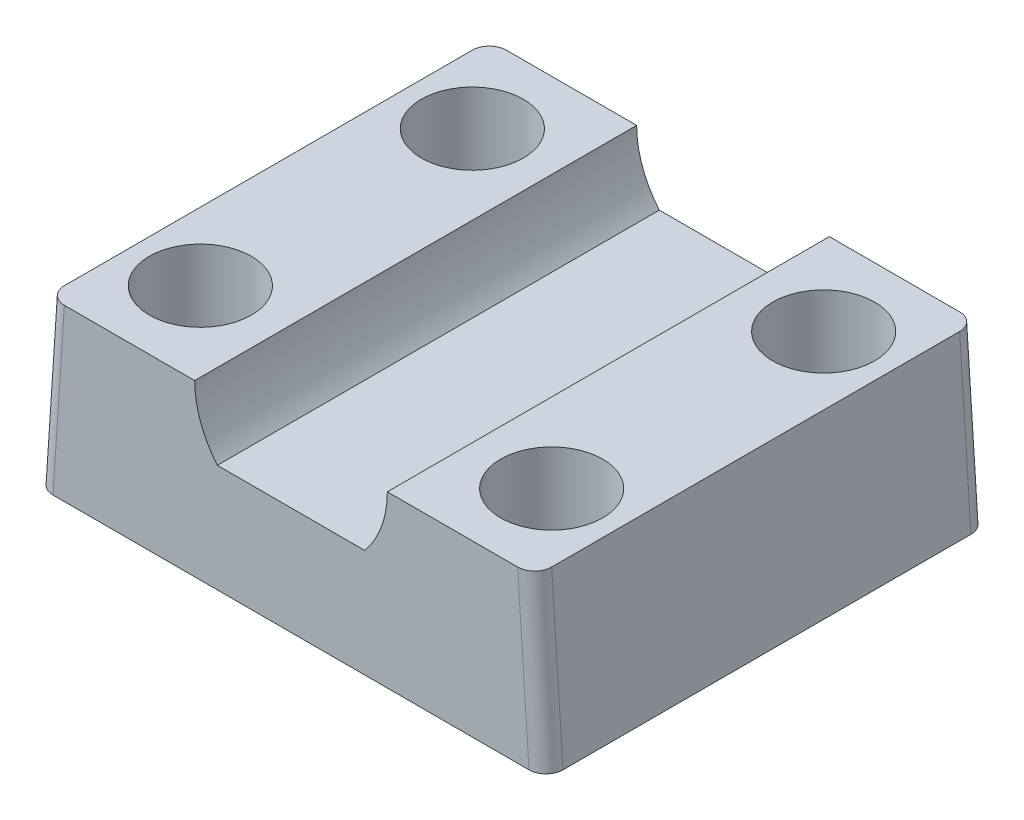
ISO-10303-21;
HEADER;
FILE_DESCRIPTION(('STEP AP214'),'2;1');
FILE_NAME('part.step','',(''),(''),'','','');
FILE_SCHEMA(('AUTOMOTIVE_DESIGN { 1 0 10303 214 1 1 1 1 }'));
ENDSEC;
DATA;
#1=APPLICATION_CONTEXT('core data for automotive mechanical design processes');
#2=APPLICATION_PROTOCOL_DEFINITION('international standard','automotive_design',2000,#1);
#3=PRODUCT_CONTEXT('',#1,'mechanical');
#4=PRODUCT('Part','Part','',(#3));
#5=PRODUCT_RELATED_PRODUCT_CATEGORY('part','',(#4));
#6=PRODUCT_DEFINITION_FORMATION('','',#4);
#7=PRODUCT_DEFINITION_CONTEXT('part definition',#1,'design');
#8=PRODUCT_DEFINITION('design','',#6,#7);
#9=PRODUCT_DEFINITION_SHAPE('','',#8);
#10=(LENGTH_UNIT() NAMED_UNIT(*) SI_UNIT(.MILLI.,.METRE.));
#11=(NAMED_UNIT(*) PLANE_ANGLE_UNIT() SI_UNIT($,.RADIAN.));
#12=(NAMED_UNIT(*) SI_UNIT($,.STERADIAN.) SOLID_ANGLE_UNIT());
#13=UNCERTAINTY_MEASURE_WITH_UNIT(LENGTH_MEASURE(1.E-05),#10,'distance_accuracy_value','');
#14=(GEOMETRIC_REPRESENTATION_CONTEXT(3) GLOBAL_UNCERTAINTY_ASSIGNED_CONTEXT((#13)) GLOBAL_UNIT_ASSIGNED_CONTEXT((#10,
#11,#12)) REPRESENTATION_CONTEXT('',''));
#15=CARTESIAN_POINT('',(0.,0.,0.));
#16=DIRECTION('',(0.,0.,1.));
#17=DIRECTION('',(1.,0.,0.));
#18=AXIS2_PLACEMENT_3D('',#15,#16,#17);
#19=CARTESIAN_POINT('',(-21.5,15.,39.));
#20=DIRECTION('',(0.,-1.,0.));
#21=DIRECTION('',(0.,0.,-1.));
#22=AXIS2_PLACEMENT_3D('',#19,#20,#21);
#23=PLANE('',#22);
#24=CARTESIAN_POINT('',(-15.5,15.,31.5));
#25=DIRECTION('',(0.,-1.,0.));
#26=DIRECTION('',(0.,0.,-1.));
#27=AXIS2_PLACEMENT_3D('',#24,#25,#26);
#28=CIRCLE('',#27,4.5);
#29=CARTESIAN_POINT('',(-15.5,15.,27.));
#30=VERTEX_POINT('',#29);
#31=EDGE_CURVE('E259',#30,#30,#28,.T.);
#32=ORIENTED_EDGE('',*,*,#31,.T.);
#33=EDGE_LOOP('',(#32));
#34=FACE_BOUND('',#33,.T.);
#35=CARTESIAN_POINT('',(-15.5,15.,7.5));
#36=DIRECTION('',(0.,-1.,0.));
#37=DIRECTION('',(0.,0.,-1.));
#38=AXIS2_PLACEMENT_3D('',#35,#36,#37);
#39=CIRCLE('',#38,4.5);
#40=CARTESIAN_POINT('',(-15.5,15.,3.));
#41=VERTEX_POINT('',#40);
#42=EDGE_CURVE('E253',#41,#41,#39,.T.);
#43=ORIENTED_EDGE('',*,*,#42,.T.);
#44=EDGE_LOOP('',(#43));
#45=FACE_BOUND('',#44,.T.);
#46=DIRECTION('',(0.,0.,-1.));
#47=VECTOR('',#46,1.);
#48=CARTESIAN_POINT('',(-21.5,15.,39.));
#49=LINE('',#48,#47);
#50=CARTESIAN_POINT('',(-21.5,15.,37.5));
#51=VERTEX_POINT('',#50);
#52=CARTESIAN_POINT('',(-21.5,15.,1.5));
#53=VERTEX_POINT('',#52);
#54=EDGE_CURVE('E187',#51,#53,#49,.T.);
#55=ORIENTED_EDGE('',*,*,#54,.F.);
#56=CARTESIAN_POINT('',(-19.9966703621627,15.,37.5));
#57=DIRECTION('',(0.,-1.,0.));
#58=DIRECTION('',(1.,0.,0.));
#59=AXIS2_PLACEMENT_3D('',#56,#57,#58);
#60=ELLIPSE('',#59,1.50332963783729,1.5);
#61=CARTESIAN_POINT('',(-19.9966703621627,15.,39.));
#62=VERTEX_POINT('',#61);
#63=EDGE_CURVE('E217',#51,#62,#60,.F.);
#64=ORIENTED_EDGE('',*,*,#63,.T.);
#65=DIRECTION('',(-1.,0.,0.));
#66=VECTOR('',#65,1.);
#67=CARTESIAN_POINT('',(-21.5,15.,39.));
#68=LINE('',#67,#66);
#69=CARTESIAN_POINT('',(-8.5,15.,39.));
#70=VERTEX_POINT('',#69);
#71=EDGE_CURVE('E173',#70,#62,#68,.T.);
#72=ORIENTED_EDGE('',*,*,#71,.F.);
#73=DIRECTION('',(0.,0.,-1.));
#74=VECTOR('',#73,1.);
#75=CARTESIAN_POINT('',(-8.5,15.,39.));
#76=LINE('',#75,#74);
#77=CARTESIAN_POINT('',(-8.5,15.,0.));
#78=VERTEX_POINT('',#77);
#79=EDGE_CURVE('E158',#70,#78,#76,.T.);
#80=ORIENTED_EDGE('',*,*,#79,.T.);
#81=DIRECTION('',(-1.,0.,0.));
#82=VECTOR('',#81,1.);
#83=CARTESIAN_POINT('',(-21.5,15.,0.));
#84=LINE('',#83,#82);
#85=CARTESIAN_POINT('',(-19.9966703621627,15.,0.));
#86=VERTEX_POINT('',#85);
#87=EDGE_CURVE('E159',#78,#86,#84,.T.);
#88=ORIENTED_EDGE('',*,*,#87,.T.);
#89=CARTESIAN_POINT('',(-19.9966703621627,15.,1.5));
#90=DIRECTION('',(0.,-1.,0.));
#91=DIRECTION('',(-1.,0.,0.));
#92=AXIS2_PLACEMENT_3D('',#89,#90,#91);
#93=ELLIPSE('',#92,1.50332963783729,1.5);
#94=EDGE_CURVE('E215',#86,#53,#93,.F.);
#95=ORIENTED_EDGE('',*,*,#94,.T.);
#96=EDGE_LOOP('',(#55,#64,#72,#80,#88,#95));
#97=FACE_BOUND('',#96,.T.);
#98=ADVANCED_FACE('F37',(#34,#45,#97),#23,.F.);
#99=CARTESIAN_POINT('',(-21.5,15.,39.));
#100=DIRECTION('',(0.997785157856609,-0.066519010523774,0.));
#101=DIRECTION('',(0.066519010523774,0.997785157856609,0.));
#102=AXIS2_PLACEMENT_3D('',#99,#100,#101);
#103=PLANE('',#102);
#104=DIRECTION('',(0.,0.,-1.));
#105=VECTOR('',#104,1.);
#106=CARTESIAN_POINT('',(-22.5,0.,39.));
#107=LINE('',#106,#105);
#108=CARTESIAN_POINT('',(-22.5,0.,37.5));
#109=VERTEX_POINT('',#108);
#110=CARTESIAN_POINT('',(-22.5,0.,1.5));
#111=VERTEX_POINT('',#110);
#112=EDGE_CURVE('E184',#109,#111,#107,.T.);
#113=ORIENTED_EDGE('',*,*,#112,.F.);
#114=DIRECTION('',(-0.066519010523774,-0.997785157856609,0.));
#115=VECTOR('',#114,1.);
#116=CARTESIAN_POINT('',(-21.5,15.,37.5));
#117=LINE('',#116,#115);
#118=EDGE_CURVE('E213',#109,#51,#117,.F.);
#119=ORIENTED_EDGE('',*,*,#118,.T.);
#120=ORIENTED_EDGE('',*,*,#54,.T.);
#121=DIRECTION('',(-0.066519010523774,-0.997785157856609,0.));
#122=VECTOR('',#121,1.);
#123=CARTESIAN_POINT('',(-21.5,15.,1.5));
#124=LINE('',#123,#122);
#125=EDGE_CURVE('E210',#53,#111,#124,.T.);
#126=ORIENTED_EDGE('',*,*,#125,.T.);
#127=EDGE_LOOP('',(#113,#119,#120,#126));
#128=FACE_BOUND('',#127,.T.);
#129=ADVANCED_FACE('F239',(#128),#103,.F.);
#130=CARTESIAN_POINT('',(-22.5,0.,39.));
#131=DIRECTION('',(0.,1.,0.));
#132=DIRECTION('',(-1.,0.,0.));
#133=AXIS2_PLACEMENT_3D('',#130,#131,#132);
#134=PLANE('',#133);
#135=CARTESIAN_POINT('',(15.5,0.,31.5));
#136=DIRECTION('',(0.,-1.,0.));
#137=DIRECTION('',(0.,0.,-1.));
#138=AXIS2_PLACEMENT_3D('',#135,#136,#137);
#139=CIRCLE('',#138,4.5);
#140=CARTESIAN_POINT('',(15.5,0.,27.));
#141=VERTEX_POINT('',#140);
#142=EDGE_CURVE('E197',#141,#141,#139,.T.);
#143=ORIENTED_EDGE('',*,*,#142,.F.);
#144=EDGE_LOOP('',(#143));
#145=FACE_BOUND('',#144,.T.);
#146=CARTESIAN_POINT('',(-15.5,0.,31.5));
#147=DIRECTION('',(0.,-1.,0.));
#148=DIRECTION('',(0.,0.,-1.));
#149=AXIS2_PLACEMENT_3D('',#146,#147,#148);
#150=CIRCLE('',#149,4.5);
#151=CARTESIAN_POINT('',(-15.5,0.,27.));
#152=VERTEX_POINT('',#151);
#153=EDGE_CURVE('E196',#152,#152,#150,.T.);
#154=ORIENTED_EDGE('',*,*,#153,.F.);
#155=EDGE_LOOP('',(#154));
#156=FACE_BOUND('',#155,.T.);
#157=CARTESIAN_POINT('',(-15.5,0.,7.5));
#158=DIRECTION('',(0.,-1.,0.));
#159=DIRECTION('',(0.,0.,-1.));
#160=AXIS2_PLACEMENT_3D('',#157,#158,#159);
#161=CIRCLE('',#160,4.5);
#162=CARTESIAN_POINT('',(-15.5,0.,3.));
#163=VERTEX_POINT('',#162);
#164=EDGE_CURVE('E256',#163,#163,#161,.T.);
#165=ORIENTED_EDGE('',*,*,#164,.F.);
#166=EDGE_LOOP('',(#165));
#167=FACE_BOUND('',#166,.T.);
#168=CARTESIAN_POINT('',(15.5,0.,7.5));
#169=DIRECTION('',(0.,-1.,0.));
#170=DIRECTION('',(0.,0.,-1.));
#171=AXIS2_PLACEMENT_3D('',#168,#169,#170);
#172=CIRCLE('',#171,4.5);
#173=CARTESIAN_POINT('',(15.5,0.,3.));
#174=VERTEX_POINT('',#173);
#175=EDGE_CURVE('E192',#174,#174,#172,.T.);
#176=ORIENTED_EDGE('',*,*,#175,.F.);
#177=EDGE_LOOP('',(#176));
#178=FACE_BOUND('',#177,.T.);
#179=DIRECTION('',(1.,0.,0.));
#180=VECTOR('',#179,1.);
#181=CARTESIAN_POINT('',(-22.5,0.,39.));
#182=LINE('',#181,#180);
#183=CARTESIAN_POINT('',(-20.9966703621627,0.,39.));
#184=VERTEX_POINT('',#183);
#185=CARTESIAN_POINT('',(20.9966703621627,0.,39.));
#186=VERTEX_POINT('',#185);
#187=EDGE_CURVE('E136',#184,#186,#182,.T.);
#188=ORIENTED_EDGE('',*,*,#187,.F.);
#189=CARTESIAN_POINT('',(-20.9966703621627,0.,37.5));
#190=DIRECTION('',(0.,1.,0.));
#191=DIRECTION('',(1.,0.,0.));
#192=AXIS2_PLACEMENT_3D('',#189,#190,#191);
#193=ELLIPSE('',#192,1.50332963783729,1.5);
#194=EDGE_CURVE('E208',#184,#109,#193,.F.);
#195=ORIENTED_EDGE('',*,*,#194,.T.);
#196=ORIENTED_EDGE('',*,*,#112,.T.);
#197=CARTESIAN_POINT('',(-20.9966703621627,0.,1.5));
#198=DIRECTION('',(0.,1.,0.));
#199=DIRECTION('',(-1.,0.,0.));
#200=AXIS2_PLACEMENT_3D('',#197,#198,#199);
#201=ELLIPSE('',#200,1.50332963783729,1.5);
#202=CARTESIAN_POINT('',(-20.9966703621627,0.,0.));
#203=VERTEX_POINT('',#202);
#204=EDGE_CURVE('E202',#111,#203,#201,.F.);
#205=ORIENTED_EDGE('',*,*,#204,.T.);
#206=DIRECTION('',(1.,0.,0.));
#207=VECTOR('',#206,1.);
#208=CARTESIAN_POINT('',(-22.5,0.,0.));
#209=LINE('',#208,#207);
#210=CARTESIAN_POINT('',(20.9966703621627,0.,0.));
#211=VERTEX_POINT('',#210);
#212=EDGE_CURVE('E162',#203,#211,#209,.T.);
#213=ORIENTED_EDGE('',*,*,#212,.T.);
#214=CARTESIAN_POINT('',(20.9966703621627,0.,1.5));
#215=DIRECTION('',(0.,1.,0.));
#216=DIRECTION('',(-1.,0.,0.));
#217=AXIS2_PLACEMENT_3D('',#214,#215,#216);
#218=ELLIPSE('',#217,1.50332963783729,1.5);
#219=CARTESIAN_POINT('',(22.5,0.,1.5));
#220=VERTEX_POINT('',#219);
#221=EDGE_CURVE('E204',#211,#220,#218,.F.);
#222=ORIENTED_EDGE('',*,*,#221,.T.);
#223=DIRECTION('',(0.,0.,-1.));
#224=VECTOR('',#223,1.);
#225=CARTESIAN_POINT('',(22.5,0.,39.));
#226=LINE('',#225,#224);
#227=CARTESIAN_POINT('',(22.5,0.,37.5));
#228=VERTEX_POINT('',#227);
#229=EDGE_CURVE('E181',#228,#220,#226,.T.);
#230=ORIENTED_EDGE('',*,*,#229,.F.);
#231=CARTESIAN_POINT('',(20.9966703621627,0.,37.5));
#232=DIRECTION('',(0.,1.,0.));
#233=DIRECTION('',(1.,0.,0.));
#234=AXIS2_PLACEMENT_3D('',#231,#232,#233);
#235=ELLIPSE('',#234,1.50332963783729,1.5);
#236=EDGE_CURVE('E206',#228,#186,#235,.F.);
#237=ORIENTED_EDGE('',*,*,#236,.T.);
#238=EDGE_LOOP('',(#188,#195,#196,#205,#213,#222,#230,#237));
#239=FACE_BOUND('',#238,.T.);
#240=ADVANCED_FACE('F243',(#145,#156,#167,#178,#239),#134,.F.);
#241=CARTESIAN_POINT('',(22.5,0.,39.));
#242=DIRECTION('',(-0.997785157856609,-0.066519010523774,0.));
#243=DIRECTION('',(0.066519010523774,-0.997785157856609,0.));
#244=AXIS2_PLACEMENT_3D('',#241,#242,#243);
#245=PLANE('',#244);
#246=DIRECTION('',(0.,0.,-1.));
#247=VECTOR('',#246,1.);
#248=CARTESIAN_POINT('',(21.5,15.,39.));
#249=LINE('',#248,#247);
#250=CARTESIAN_POINT('',(21.5,15.,37.5));
#251=VERTEX_POINT('',#250);
#252=CARTESIAN_POINT('',(21.5,15.,1.5));
#253=VERTEX_POINT('',#252);
#254=EDGE_CURVE('E145',#251,#253,#249,.T.);
#255=ORIENTED_EDGE('',*,*,#254,.F.);
#256=DIRECTION('',(-0.066519010523774,0.997785157856609,0.));
#257=VECTOR('',#256,1.);
#258=CARTESIAN_POINT('',(22.5,0.,37.5));
#259=LINE('',#258,#257);
#260=EDGE_CURVE('E223',#251,#228,#259,.F.);
#261=ORIENTED_EDGE('',*,*,#260,.T.);
#262=ORIENTED_EDGE('',*,*,#229,.T.);
#263=DIRECTION('',(-0.066519010523774,0.997785157856609,0.));
#264=VECTOR('',#263,1.);
#265=CARTESIAN_POINT('',(22.5,0.,1.5));
#266=LINE('',#265,#264);
#267=EDGE_CURVE('E221',#220,#253,#266,.T.);
#268=ORIENTED_EDGE('',*,*,#267,.T.);
#269=EDGE_LOOP('',(#255,#261,#262,#268));
#270=FACE_BOUND('',#269,.T.);
#271=ADVANCED_FACE('F272',(#270),#245,.F.);
#272=CARTESIAN_POINT('',(21.5,15.,39.));
#273=DIRECTION('',(0.,-1.,0.));
#274=DIRECTION('',(0.,0.,-1.));
#275=AXIS2_PLACEMENT_3D('',#272,#273,#274);
#276=PLANE('',#275);
#277=CARTESIAN_POINT('',(15.5,15.,31.5));
#278=DIRECTION('',(0.,-1.,0.));
#279=DIRECTION('',(0.,0.,-1.));
#280=AXIS2_PLACEMENT_3D('',#277,#278,#279);
#281=CIRCLE('',#280,4.5);
#282=CARTESIAN_POINT('',(15.5,15.,27.));
#283=VERTEX_POINT('',#282);
#284=EDGE_CURVE('E193',#283,#283,#281,.T.);
#285=ORIENTED_EDGE('',*,*,#284,.T.);
#286=EDGE_LOOP('',(#285));
#287=FACE_BOUND('',#286,.T.);
#288=CARTESIAN_POINT('',(15.5,15.,7.5));
#289=DIRECTION('',(0.,-1.,0.));
#290=DIRECTION('',(0.,0.,-1.));
#291=AXIS2_PLACEMENT_3D('',#288,#289,#290);
#292=CIRCLE('',#291,4.5);
#293=CARTESIAN_POINT('',(15.5,15.,3.));
#294=VERTEX_POINT('',#293);
#295=EDGE_CURVE('E163',#294,#294,#292,.T.);
#296=ORIENTED_EDGE('',*,*,#295,.T.);
#297=EDGE_LOOP('',(#296));
#298=FACE_BOUND('',#297,.T.);
#299=DIRECTION('',(-1.,0.,0.));
#300=VECTOR('',#299,1.);
#301=CARTESIAN_POINT('',(21.5,15.,39.));
#302=LINE('',#301,#300);
#303=CARTESIAN_POINT('',(19.9966703621627,15.,39.));
#304=VERTEX_POINT('',#303);
#305=CARTESIAN_POINT('',(8.5,15.,39.));
#306=VERTEX_POINT('',#305);
#307=EDGE_CURVE('E126',#304,#306,#302,.T.);
#308=ORIENTED_EDGE('',*,*,#307,.F.);
#309=CARTESIAN_POINT('',(19.9966703621627,15.,37.5));
#310=DIRECTION('',(0.,-1.,0.));
#311=DIRECTION('',(1.,0.,0.));
#312=AXIS2_PLACEMENT_3D('',#309,#310,#311);
#313=ELLIPSE('',#312,1.50332963783729,1.5);
#314=EDGE_CURVE('E60',#304,#251,#313,.F.);
#315=ORIENTED_EDGE('',*,*,#314,.T.);
#316=ORIENTED_EDGE('',*,*,#254,.T.);
#317=CARTESIAN_POINT('',(19.9966703621627,15.,1.5));
#318=DIRECTION('',(0.,-1.,0.));
#319=DIRECTION('',(-1.,0.,0.));
#320=AXIS2_PLACEMENT_3D('',#317,#318,#319);
#321=ELLIPSE('',#320,1.50332963783729,1.5);
#322=CARTESIAN_POINT('',(19.9966703621627,15.,0.));
#323=VERTEX_POINT('',#322);
#324=EDGE_CURVE('E52',#253,#323,#321,.F.);
#325=ORIENTED_EDGE('',*,*,#324,.T.);
#326=DIRECTION('',(-1.,0.,0.));
#327=VECTOR('',#326,1.);
#328=CARTESIAN_POINT('',(21.5,15.,0.));
#329=LINE('',#328,#327);
#330=CARTESIAN_POINT('',(8.5,15.,0.));
#331=VERTEX_POINT('',#330);
#332=EDGE_CURVE('E142',#323,#331,#329,.T.);
#333=ORIENTED_EDGE('',*,*,#332,.T.);
#334=DIRECTION('',(0.,0.,-1.));
#335=VECTOR('',#334,1.);
#336=CARTESIAN_POINT('',(8.5,15.,39.));
#337=LINE('',#336,#335);
#338=EDGE_CURVE('E139',#306,#331,#337,.T.);
#339=ORIENTED_EDGE('',*,*,#338,.F.);
#340=EDGE_LOOP('',(#308,#315,#316,#325,#333,#339));
#341=FACE_BOUND('',#340,.T.);
#342=ADVANCED_FACE('F140',(#287,#298,#341),#276,.F.);
#343=CARTESIAN_POINT('',(0.,15.,39.));
#344=DIRECTION('',(0.,0.,-1.));
#345=DIRECTION('',(-1.,0.,0.));
#346=AXIS2_PLACEMENT_3D('',#343,#344,#345);
#347=CYLINDRICAL_SURFACE('',#346,8.5);
#348=CARTESIAN_POINT('',(0.,15.,0.));
#349=DIRECTION('',(0.,0.,-1.));
#350=DIRECTION('',(1.,0.,0.));
#351=AXIS2_PLACEMENT_3D('',#348,#349,#350);
#352=CIRCLE('',#351,8.5);
#353=CARTESIAN_POINT('',(6.5,9.52277442494834,0.));
#354=VERTEX_POINT('',#353);
#355=EDGE_CURVE('E167',#331,#354,#352,.T.);
#356=ORIENTED_EDGE('',*,*,#355,.T.);
#357=DIRECTION('',(0.,0.,-1.));
#358=VECTOR('',#357,1.);
#359=CARTESIAN_POINT('',(6.5,9.52277442494834,39.));
#360=LINE('',#359,#358);
#361=CARTESIAN_POINT('',(6.5,9.52277442494834,39.));
#362=VERTEX_POINT('',#361);
#363=EDGE_CURVE('E146',#362,#354,#360,.T.);
#364=ORIENTED_EDGE('',*,*,#363,.F.);
#365=CARTESIAN_POINT('',(0.,15.,39.));
#366=DIRECTION('',(0.,0.,-1.));
#367=DIRECTION('',(1.,0.,0.));
#368=AXIS2_PLACEMENT_3D('',#365,#366,#367);
#369=CIRCLE('',#368,8.5);
#370=EDGE_CURVE('E131',#306,#362,#369,.T.);
#371=ORIENTED_EDGE('',*,*,#370,.F.);
#372=ORIENTED_EDGE('',*,*,#338,.T.);
#373=EDGE_LOOP('',(#356,#364,#371,#372));
#374=FACE_BOUND('',#373,.T.);
#375=ADVANCED_FACE('F148',(#374),#347,.F.);
#376=CARTESIAN_POINT('',(-6.5,9.52277442494834,39.));
#377=DIRECTION('',(0.,-1.,0.));
#378=DIRECTION('',(0.,0.,-1.));
#379=AXIS2_PLACEMENT_3D('',#376,#377,#378);
#380=PLANE('',#379);
#381=DIRECTION('',(-1.,0.,0.));
#382=VECTOR('',#381,1.);
#383=CARTESIAN_POINT('',(-6.5,9.52277442494834,0.));
#384=LINE('',#383,#382);
#385=CARTESIAN_POINT('',(-6.5,9.52277442494834,0.));
#386=VERTEX_POINT('',#385);
#387=EDGE_CURVE('E169',#354,#386,#384,.T.);
#388=ORIENTED_EDGE('',*,*,#387,.T.);
#389=DIRECTION('',(0.,0.,-1.));
#390=VECTOR('',#389,1.);
#391=CARTESIAN_POINT('',(-6.5,9.52277442494834,39.));
#392=LINE('',#391,#390);
#393=CARTESIAN_POINT('',(-6.5,9.52277442494834,39.));
#394=VERTEX_POINT('',#393);
#395=EDGE_CURVE('E176',#394,#386,#392,.T.);
#396=ORIENTED_EDGE('',*,*,#395,.F.);
#397=DIRECTION('',(-1.,0.,0.));
#398=VECTOR('',#397,1.);
#399=CARTESIAN_POINT('',(-6.5,9.52277442494834,39.));
#400=LINE('',#399,#398);
#401=EDGE_CURVE('E151',#362,#394,#400,.T.);
#402=ORIENTED_EDGE('',*,*,#401,.F.);
#403=ORIENTED_EDGE('',*,*,#363,.T.);
#404=EDGE_LOOP('',(#388,#396,#402,#403));
#405=FACE_BOUND('',#404,.T.);
#406=ADVANCED_FACE('F295',(#405),#380,.F.);
#407=CARTESIAN_POINT('',(0.,15.,39.));
#408=DIRECTION('',(0.,0.,-1.));
#409=DIRECTION('',(-1.,0.,0.));
#410=AXIS2_PLACEMENT_3D('',#407,#408,#409);
#411=CYLINDRICAL_SURFACE('',#410,8.5);
#412=CARTESIAN_POINT('',(0.,15.,0.));
#413=DIRECTION('',(0.,0.,-1.));
#414=DIRECTION('',(1.,0.,0.));
#415=AXIS2_PLACEMENT_3D('',#412,#413,#414);
#416=CIRCLE('',#415,8.5);
#417=EDGE_CURVE('E171',#386,#78,#416,.T.);
#418=ORIENTED_EDGE('',*,*,#417,.T.);
#419=ORIENTED_EDGE('',*,*,#79,.F.);
#420=CARTESIAN_POINT('',(0.,15.,39.));
#421=DIRECTION('',(0.,0.,-1.));
#422=DIRECTION('',(1.,0.,0.));
#423=AXIS2_PLACEMENT_3D('',#420,#421,#422);
#424=CIRCLE('',#423,8.5);
#425=EDGE_CURVE('E153',#394,#70,#424,.T.);
#426=ORIENTED_EDGE('',*,*,#425,.F.);
#427=ORIENTED_EDGE('',*,*,#395,.T.);
#428=EDGE_LOOP('',(#418,#419,#426,#427));
#429=FACE_BOUND('',#428,.T.);
#430=ADVANCED_FACE('F327',(#429),#411,.F.);
#431=CARTESIAN_POINT('',(0.,15.,39.));
#432=DIRECTION('',(0.,0.,1.));
#433=DIRECTION('',(1.,0.,0.));
#434=AXIS2_PLACEMENT_3D('',#431,#432,#433);
#435=PLANE('',#434);
#436=ORIENTED_EDGE('',*,*,#71,.T.);
#437=DIRECTION('',(-0.066519010523774,-0.997785157856609,0.));
#438=VECTOR('',#437,1.);
#439=CARTESIAN_POINT('',(-21.0033222632151,-0.0997785157856625,39.));
#440=LINE('',#439,#438);
#441=EDGE_CURVE('E199',#62,#184,#440,.T.);
#442=ORIENTED_EDGE('',*,*,#441,.T.);
#443=ORIENTED_EDGE('',*,*,#187,.T.);
#444=DIRECTION('',(-0.066519010523774,0.997785157856609,0.));
#445=VECTOR('',#444,1.);
#446=CARTESIAN_POINT('',(20.0033222632151,14.9002214842143,39.));
#447=LINE('',#446,#445);
#448=EDGE_CURVE('E135',#186,#304,#447,.T.);
#449=ORIENTED_EDGE('',*,*,#448,.T.);
#450=ORIENTED_EDGE('',*,*,#307,.T.);
#451=ORIENTED_EDGE('',*,*,#370,.T.);
#452=ORIENTED_EDGE('',*,*,#401,.T.);
#453=ORIENTED_EDGE('',*,*,#425,.T.);
#454=EDGE_LOOP('',(#436,#442,#443,#449,#450,#451,#452,#453));
#455=FACE_BOUND('',#454,.T.);
#456=ADVANCED_FACE('F129',(#455),#435,.T.);
#457=CARTESIAN_POINT('',(0.,15.,0.));
#458=DIRECTION('',(0.,0.,1.));
#459=DIRECTION('',(1.,0.,0.));
#460=AXIS2_PLACEMENT_3D('',#457,#458,#459);
#461=PLANE('',#460);
#462=ORIENTED_EDGE('',*,*,#332,.F.);
#463=DIRECTION('',(-0.066519010523774,0.997785157856609,0.));
#464=VECTOR('',#463,1.);
#465=CARTESIAN_POINT('',(19.9081895198523,16.3272126346568,0.));
#466=LINE('',#465,#464);
#467=EDGE_CURVE('E11',#323,#211,#466,.F.);
#468=ORIENTED_EDGE('',*,*,#467,.T.);
#469=ORIENTED_EDGE('',*,*,#212,.F.);
#470=DIRECTION('',(-0.066519010523774,-0.997785157856609,0.));
#471=VECTOR('',#470,1.);
#472=CARTESIAN_POINT('',(-19.9081895198523,16.3272126346568,0.));
#473=LINE('',#472,#471);
#474=EDGE_CURVE('E45',#203,#86,#473,.F.);
#475=ORIENTED_EDGE('',*,*,#474,.T.);
#476=ORIENTED_EDGE('',*,*,#87,.F.);
#477=ORIENTED_EDGE('',*,*,#417,.F.);
#478=ORIENTED_EDGE('',*,*,#387,.F.);
#479=ORIENTED_EDGE('',*,*,#355,.F.);
#480=EDGE_LOOP('',(#462,#468,#469,#475,#476,#477,#478,#479));
#481=FACE_BOUND('',#480,.T.);
#482=ADVANCED_FACE('F228',(#481),#461,.F.);
#483=CARTESIAN_POINT('',(15.5,0.,7.5));
#484=DIRECTION('',(0.,-1.,0.));
#485=DIRECTION('',(0.,0.,-1.));
#486=AXIS2_PLACEMENT_3D('',#483,#484,#485);
#487=CYLINDRICAL_SURFACE('',#486,4.5);
#488=ORIENTED_EDGE('',*,*,#175,.T.);
#489=EDGE_LOOP('',(#488));
#490=FACE_BOUND('',#489,.T.);
#491=ORIENTED_EDGE('',*,*,#295,.F.);
#492=EDGE_LOOP('',(#491));
#493=FACE_BOUND('',#492,.T.);
#494=ADVANCED_FACE('F280',(#490,#493),#487,.F.);
#495=CARTESIAN_POINT('',(-15.5,0.,7.5));
#496=DIRECTION('',(0.,-1.,0.));
#497=DIRECTION('',(0.,0.,-1.));
#498=AXIS2_PLACEMENT_3D('',#495,#496,#497);
#499=CYLINDRICAL_SURFACE('',#498,4.5);
#500=ORIENTED_EDGE('',*,*,#164,.T.);
#501=EDGE_LOOP('',(#500));
#502=FACE_BOUND('',#501,.T.);
#503=ORIENTED_EDGE('',*,*,#42,.F.);
#504=EDGE_LOOP('',(#503));
#505=FACE_BOUND('',#504,.T.);
#506=ADVANCED_FACE('F283',(#502,#505),#499,.F.);
#507=CARTESIAN_POINT('',(-15.5,0.,31.5));
#508=DIRECTION('',(0.,-1.,0.));
#509=DIRECTION('',(0.,0.,-1.));
#510=AXIS2_PLACEMENT_3D('',#507,#508,#509);
#511=CYLINDRICAL_SURFACE('',#510,4.5);
#512=ORIENTED_EDGE('',*,*,#153,.T.);
#513=EDGE_LOOP('',(#512));
#514=FACE_BOUND('',#513,.T.);
#515=ORIENTED_EDGE('',*,*,#31,.F.);
#516=EDGE_LOOP('',(#515));
#517=FACE_BOUND('',#516,.T.);
#518=ADVANCED_FACE('F341',(#514,#517),#511,.F.);
#519=CARTESIAN_POINT('',(15.5,0.,31.5));
#520=DIRECTION('',(0.,-1.,0.));
#521=DIRECTION('',(0.,0.,-1.));
#522=AXIS2_PLACEMENT_3D('',#519,#520,#521);
#523=CYLINDRICAL_SURFACE('',#522,4.5);
#524=ORIENTED_EDGE('',*,*,#142,.T.);
#525=EDGE_LOOP('',(#524));
#526=FACE_BOUND('',#525,.T.);
#527=ORIENTED_EDGE('',*,*,#284,.F.);
#528=EDGE_LOOP('',(#527));
#529=FACE_BOUND('',#528,.T.);
#530=ADVANCED_FACE('F267',(#526,#529),#523,.F.);
#531=CARTESIAN_POINT('',(-19.9081895198523,16.3272126346568,37.5));
#532=DIRECTION('',(0.066519010523774,0.997785157856609,0.));
#533=DIRECTION('',(-0.997785157856609,0.066519010523774,0.));
#534=AXIS2_PLACEMENT_3D('',#531,#532,#533);
#535=CYLINDRICAL_SURFACE('',#534,1.5);
#536=ORIENTED_EDGE('',*,*,#63,.F.);
#537=ORIENTED_EDGE('',*,*,#118,.F.);
#538=ORIENTED_EDGE('',*,*,#194,.F.);
#539=ORIENTED_EDGE('',*,*,#441,.F.);
#540=EDGE_LOOP('',(#536,#537,#538,#539));
#541=FACE_BOUND('',#540,.T.);
#542=ADVANCED_FACE('F247',(#541),#535,.T.);
#543=CARTESIAN_POINT('',(19.9081895198523,16.3272126346568,37.5));
#544=DIRECTION('',(0.066519010523774,-0.997785157856609,0.));
#545=DIRECTION('',(0.997785157856609,0.066519010523774,0.));
#546=AXIS2_PLACEMENT_3D('',#543,#544,#545);
#547=CYLINDRICAL_SURFACE('',#546,1.5);
#548=ORIENTED_EDGE('',*,*,#236,.F.);
#549=ORIENTED_EDGE('',*,*,#260,.F.);
#550=ORIENTED_EDGE('',*,*,#314,.F.);
#551=ORIENTED_EDGE('',*,*,#448,.F.);
#552=EDGE_LOOP('',(#548,#549,#550,#551));
#553=FACE_BOUND('',#552,.T.);
#554=ADVANCED_FACE('F311',(#553),#547,.T.);
#555=CARTESIAN_POINT('',(21.0033222632151,-0.0997785157856528,1.5));
#556=DIRECTION('',(-0.066519010523774,0.997785157856609,0.));
#557=DIRECTION('',(-0.997785157856609,-0.066519010523774,0.));
#558=AXIS2_PLACEMENT_3D('',#555,#556,#557);
#559=CYLINDRICAL_SURFACE('',#558,1.5);
#560=ORIENTED_EDGE('',*,*,#221,.F.);
#561=ORIENTED_EDGE('',*,*,#467,.F.);
#562=ORIENTED_EDGE('',*,*,#324,.F.);
#563=ORIENTED_EDGE('',*,*,#267,.F.);
#564=EDGE_LOOP('',(#560,#561,#562,#563));
#565=FACE_BOUND('',#564,.T.);
#566=ADVANCED_FACE('F313',(#565),#559,.T.);
#567=CARTESIAN_POINT('',(-20.0033222632151,14.9002214842143,1.5));
#568=DIRECTION('',(-0.066519010523774,-0.997785157856609,0.));
#569=DIRECTION('',(0.997785157856609,-0.066519010523774,0.));
#570=AXIS2_PLACEMENT_3D('',#567,#568,#569);
#571=CYLINDRICAL_SURFACE('',#570,1.5);
#572=ORIENTED_EDGE('',*,*,#94,.F.);
#573=ORIENTED_EDGE('',*,*,#474,.F.);
#574=ORIENTED_EDGE('',*,*,#204,.F.);
#575=ORIENTED_EDGE('',*,*,#125,.F.);
#576=EDGE_LOOP('',(#572,#573,#574,#575));
#577=FACE_BOUND('',#576,.T.);
#578=ADVANCED_FACE('F39',(#577),#571,.T.);
#579=CLOSED_SHELL('',(#98,#129,#240,#271,#342,#375,#406,#430,#456,#482,#494,#506,#518,#530,#542,
#554,#566,#578));
#580=MANIFOLD_SOLID_BREP('B2',#579);
#581=ADVANCED_BREP_SHAPE_REPRESENTATION('',(#18,#580),#14);
#582=SHAPE_DEFINITION_REPRESENTATION(#9,#581);
ENDSEC;
END-ISO-10303-21;
